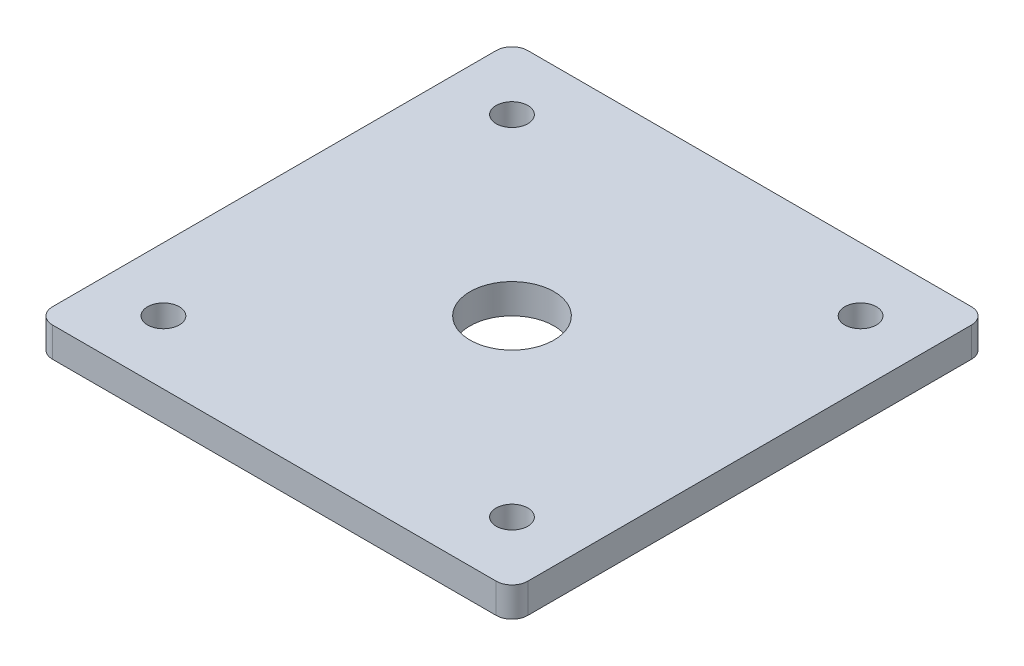
ISO-10303-21;
HEADER;
FILE_DESCRIPTION(('STEP AP214'),'2;1');
FILE_NAME('part.step','',(''),(''),'','','');
FILE_SCHEMA(('AUTOMOTIVE_DESIGN { 1 0 10303 214 1 1 1 1 }'));
ENDSEC;
DATA;
#1=APPLICATION_CONTEXT('core data for automotive mechanical design processes');
#2=APPLICATION_PROTOCOL_DEFINITION('international standard','automotive_design',2000,#1);
#3=PRODUCT_CONTEXT('',#1,'mechanical');
#4=PRODUCT('Part','Part','',(#3));
#5=PRODUCT_RELATED_PRODUCT_CATEGORY('part','',(#4));
#6=PRODUCT_DEFINITION_FORMATION('','',#4);
#7=PRODUCT_DEFINITION_CONTEXT('part definition',#1,'design');
#8=PRODUCT_DEFINITION('design','',#6,#7);
#9=PRODUCT_DEFINITION_SHAPE('','',#8);
#10=(LENGTH_UNIT() NAMED_UNIT(*) SI_UNIT(.MILLI.,.METRE.));
#11=(NAMED_UNIT(*) PLANE_ANGLE_UNIT() SI_UNIT($,.RADIAN.));
#12=(NAMED_UNIT(*) SI_UNIT($,.STERADIAN.) SOLID_ANGLE_UNIT());
#13=UNCERTAINTY_MEASURE_WITH_UNIT(LENGTH_MEASURE(1.E-05),#10,'distance_accuracy_value','');
#14=(GEOMETRIC_REPRESENTATION_CONTEXT(3) GLOBAL_UNCERTAINTY_ASSIGNED_CONTEXT((#13)) GLOBAL_UNIT_ASSIGNED_CONTEXT((#10,
#11,#12)) REPRESENTATION_CONTEXT('',''));
#15=CARTESIAN_POINT('',(0.,0.,0.));
#16=DIRECTION('',(0.,0.,1.));
#17=DIRECTION('',(1.,0.,0.));
#18=AXIS2_PLACEMENT_3D('',#15,#16,#17);
#19=CARTESIAN_POINT('',(0.,2.38125,0.));
#20=DIRECTION('',(0.,1.,0.));
#21=DIRECTION('',(0.,0.,1.));
#22=AXIS2_PLACEMENT_3D('',#19,#20,#21);
#23=PLANE('',#22);
#24=CARTESIAN_POINT('',(13.97,2.38125,-13.97));
#25=DIRECTION('',(0.,1.,0.));
#26=DIRECTION('',(0.,0.,1.));
#27=AXIS2_PLACEMENT_3D('',#24,#25,#26);
#28=CIRCLE('',#27,1.27);
#29=CARTESIAN_POINT('',(13.97,2.38125,-15.24));
#30=VERTEX_POINT('',#29);
#31=EDGE_CURVE('E195',#30,#30,#28,.T.);
#32=ORIENTED_EDGE('',*,*,#31,.F.);
#33=EDGE_LOOP('',(#32));
#34=FACE_BOUND('',#33,.T.);
#35=CARTESIAN_POINT('',(-13.97,2.38125,13.97));
#36=DIRECTION('',(0.,1.,0.));
#37=DIRECTION('',(0.,0.,1.));
#38=AXIS2_PLACEMENT_3D('',#35,#36,#37);
#39=CIRCLE('',#38,1.27);
#40=CARTESIAN_POINT('',(-13.97,2.38125,12.7));
#41=VERTEX_POINT('',#40);
#42=EDGE_CURVE('E184',#41,#41,#39,.T.);
#43=ORIENTED_EDGE('',*,*,#42,.F.);
#44=EDGE_LOOP('',(#43));
#45=FACE_BOUND('',#44,.T.);
#46=DIRECTION('',(-1.,0.,0.));
#47=VECTOR('',#46,1.);
#48=CARTESIAN_POINT('',(-19.05,2.38125,-19.05));
#49=LINE('',#48,#47);
#50=CARTESIAN_POINT('',(17.78,2.38125,-19.05));
#51=VERTEX_POINT('',#50);
#52=CARTESIAN_POINT('',(-17.78,2.38125,-19.05));
#53=VERTEX_POINT('',#52);
#54=EDGE_CURVE('E170',#51,#53,#49,.T.);
#55=ORIENTED_EDGE('',*,*,#54,.T.);
#56=CARTESIAN_POINT('',(-17.78,2.38125,-17.78));
#57=DIRECTION('',(0.,1.,0.));
#58=DIRECTION('',(0.,0.,1.));
#59=AXIS2_PLACEMENT_3D('',#56,#57,#58);
#60=CIRCLE('',#59,1.27);
#61=CARTESIAN_POINT('',(-19.05,2.38125,-17.78));
#62=VERTEX_POINT('',#61);
#63=EDGE_CURVE('E148',#53,#62,#60,.T.);
#64=ORIENTED_EDGE('',*,*,#63,.T.);
#65=DIRECTION('',(0.,0.,1.));
#66=VECTOR('',#65,1.);
#67=CARTESIAN_POINT('',(-19.05,2.38125,-19.05));
#68=LINE('',#67,#66);
#69=CARTESIAN_POINT('',(-19.05,2.38125,17.78));
#70=VERTEX_POINT('',#69);
#71=EDGE_CURVE('E118',#62,#70,#68,.T.);
#72=ORIENTED_EDGE('',*,*,#71,.T.);
#73=CARTESIAN_POINT('',(-17.78,2.38125,17.78));
#74=DIRECTION('',(0.,1.,0.));
#75=DIRECTION('',(0.,0.,1.));
#76=AXIS2_PLACEMENT_3D('',#73,#74,#75);
#77=CIRCLE('',#76,1.27);
#78=CARTESIAN_POINT('',(-17.78,2.38125,19.05));
#79=VERTEX_POINT('',#78);
#80=EDGE_CURVE('E54',#70,#79,#77,.T.);
#81=ORIENTED_EDGE('',*,*,#80,.T.);
#82=DIRECTION('',(1.,0.,0.));
#83=VECTOR('',#82,1.);
#84=CARTESIAN_POINT('',(-19.05,2.38125,19.05));
#85=LINE('',#84,#83);
#86=CARTESIAN_POINT('',(17.78,2.38125,19.05));
#87=VERTEX_POINT('',#86);
#88=EDGE_CURVE('E134',#79,#87,#85,.T.);
#89=ORIENTED_EDGE('',*,*,#88,.T.);
#90=CARTESIAN_POINT('',(17.78,2.38125,17.78));
#91=DIRECTION('',(0.,1.,0.));
#92=DIRECTION('',(0.,0.,1.));
#93=AXIS2_PLACEMENT_3D('',#90,#91,#92);
#94=CIRCLE('',#93,1.27);
#95=CARTESIAN_POINT('',(19.05,2.38125,17.78));
#96=VERTEX_POINT('',#95);
#97=EDGE_CURVE('E144',#87,#96,#94,.T.);
#98=ORIENTED_EDGE('',*,*,#97,.T.);
#99=DIRECTION('',(0.,0.,-1.));
#100=VECTOR('',#99,1.);
#101=CARTESIAN_POINT('',(19.05,2.38125,-19.05));
#102=LINE('',#101,#100);
#103=CARTESIAN_POINT('',(19.05,2.38125,-17.78));
#104=VERTEX_POINT('',#103);
#105=EDGE_CURVE('E128',#96,#104,#102,.T.);
#106=ORIENTED_EDGE('',*,*,#105,.T.);
#107=CARTESIAN_POINT('',(17.78,2.38125,-17.78));
#108=DIRECTION('',(0.,1.,0.));
#109=DIRECTION('',(0.,0.,1.));
#110=AXIS2_PLACEMENT_3D('',#107,#108,#109);
#111=CIRCLE('',#110,1.27);
#112=EDGE_CURVE('E146',#104,#51,#111,.T.);
#113=ORIENTED_EDGE('',*,*,#112,.T.);
#114=EDGE_LOOP('',(#55,#64,#72,#81,#89,#98,#106,#113));
#115=FACE_BOUND('',#114,.T.);
#116=CARTESIAN_POINT('',(-13.97,2.38125,-13.97));
#117=DIRECTION('',(0.,1.,0.));
#118=DIRECTION('',(0.,0.,1.));
#119=AXIS2_PLACEMENT_3D('',#116,#117,#118);
#120=CIRCLE('',#119,1.27);
#121=CARTESIAN_POINT('',(-13.97,2.38125,-15.24));
#122=VERTEX_POINT('',#121);
#123=EDGE_CURVE('E179',#122,#122,#120,.T.);
#124=ORIENTED_EDGE('',*,*,#123,.F.);
#125=EDGE_LOOP('',(#124));
#126=FACE_BOUND('',#125,.T.);
#127=CARTESIAN_POINT('',(13.97,2.38125,13.97));
#128=DIRECTION('',(0.,1.,0.));
#129=DIRECTION('',(0.,0.,1.));
#130=AXIS2_PLACEMENT_3D('',#127,#128,#129);
#131=CIRCLE('',#130,1.27);
#132=CARTESIAN_POINT('',(13.97,2.38125,12.7));
#133=VERTEX_POINT('',#132);
#134=EDGE_CURVE('E189',#133,#133,#131,.T.);
#135=ORIENTED_EDGE('',*,*,#134,.F.);
#136=EDGE_LOOP('',(#135));
#137=FACE_BOUND('',#136,.T.);
#138=CARTESIAN_POINT('',(0.,2.38125,0.));
#139=DIRECTION('',(0.,1.,0.));
#140=DIRECTION('',(0.,0.,1.));
#141=AXIS2_PLACEMENT_3D('',#138,#139,#140);
#142=CIRCLE('',#141,3.3655);
#143=CARTESIAN_POINT('',(0.,2.38125,-3.3655));
#144=VERTEX_POINT('',#143);
#145=EDGE_CURVE('E201',#144,#144,#142,.T.);
#146=ORIENTED_EDGE('',*,*,#145,.F.);
#147=EDGE_LOOP('',(#146));
#148=FACE_BOUND('',#147,.T.);
#149=ADVANCED_FACE('F34',(#34,#45,#115,#126,#137,#148),#23,.T.);
#150=CARTESIAN_POINT('',(0.,0.,0.));
#151=DIRECTION('',(0.,1.,0.));
#152=DIRECTION('',(0.,0.,1.));
#153=AXIS2_PLACEMENT_3D('',#150,#151,#152);
#154=PLANE('',#153);
#155=DIRECTION('',(0.,0.,1.));
#156=VECTOR('',#155,1.);
#157=CARTESIAN_POINT('',(-19.05,0.,-19.05));
#158=LINE('',#157,#156);
#159=CARTESIAN_POINT('',(-19.05,0.,-17.78));
#160=VERTEX_POINT('',#159);
#161=CARTESIAN_POINT('',(-19.05,0.,17.78));
#162=VERTEX_POINT('',#161);
#163=EDGE_CURVE('E116',#160,#162,#158,.T.);
#164=ORIENTED_EDGE('',*,*,#163,.F.);
#165=CARTESIAN_POINT('',(-17.78,0.,-17.78));
#166=DIRECTION('',(0.,1.,0.));
#167=DIRECTION('',(0.,0.,1.));
#168=AXIS2_PLACEMENT_3D('',#165,#166,#167);
#169=CIRCLE('',#168,1.27);
#170=CARTESIAN_POINT('',(-17.78,0.,-19.05));
#171=VERTEX_POINT('',#170);
#172=EDGE_CURVE('E99',#160,#171,#169,.F.);
#173=ORIENTED_EDGE('',*,*,#172,.T.);
#174=DIRECTION('',(-1.,0.,0.));
#175=VECTOR('',#174,1.);
#176=CARTESIAN_POINT('',(-19.05,0.,-19.05));
#177=LINE('',#176,#175);
#178=CARTESIAN_POINT('',(17.78,0.,-19.05));
#179=VERTEX_POINT('',#178);
#180=EDGE_CURVE('E126',#179,#171,#177,.T.);
#181=ORIENTED_EDGE('',*,*,#180,.F.);
#182=CARTESIAN_POINT('',(17.78,0.,-17.78));
#183=DIRECTION('',(0.,1.,0.));
#184=DIRECTION('',(0.,0.,1.));
#185=AXIS2_PLACEMENT_3D('',#182,#183,#184);
#186=CIRCLE('',#185,1.27);
#187=CARTESIAN_POINT('',(19.05,0.,-17.78));
#188=VERTEX_POINT('',#187);
#189=EDGE_CURVE('E110',#179,#188,#186,.F.);
#190=ORIENTED_EDGE('',*,*,#189,.T.);
#191=DIRECTION('',(0.,0.,-1.));
#192=VECTOR('',#191,1.);
#193=CARTESIAN_POINT('',(19.05,0.,-19.05));
#194=LINE('',#193,#192);
#195=CARTESIAN_POINT('',(19.05,0.,17.78));
#196=VERTEX_POINT('',#195);
#197=EDGE_CURVE('E130',#196,#188,#194,.T.);
#198=ORIENTED_EDGE('',*,*,#197,.F.);
#199=CARTESIAN_POINT('',(17.78,0.,17.78));
#200=DIRECTION('',(0.,1.,0.));
#201=DIRECTION('',(0.,0.,1.));
#202=AXIS2_PLACEMENT_3D('',#199,#200,#201);
#203=CIRCLE('',#202,1.27);
#204=CARTESIAN_POINT('',(17.78,0.,19.05));
#205=VERTEX_POINT('',#204);
#206=EDGE_CURVE('E137',#196,#205,#203,.F.);
#207=ORIENTED_EDGE('',*,*,#206,.T.);
#208=DIRECTION('',(1.,0.,0.));
#209=VECTOR('',#208,1.);
#210=CARTESIAN_POINT('',(-19.05,0.,19.05));
#211=LINE('',#210,#209);
#212=CARTESIAN_POINT('',(-17.78,0.,19.05));
#213=VERTEX_POINT('',#212);
#214=EDGE_CURVE('E125',#213,#205,#211,.T.);
#215=ORIENTED_EDGE('',*,*,#214,.F.);
#216=CARTESIAN_POINT('',(-17.78,0.,17.78));
#217=DIRECTION('',(0.,1.,0.));
#218=DIRECTION('',(0.,0.,1.));
#219=AXIS2_PLACEMENT_3D('',#216,#217,#218);
#220=CIRCLE('',#219,1.27);
#221=EDGE_CURVE('E119',#213,#162,#220,.F.);
#222=ORIENTED_EDGE('',*,*,#221,.T.);
#223=EDGE_LOOP('',(#164,#173,#181,#190,#198,#207,#215,#222));
#224=FACE_BOUND('',#223,.T.);
#225=CARTESIAN_POINT('',(-13.97,0.,-13.97));
#226=DIRECTION('',(0.,1.,0.));
#227=DIRECTION('',(0.,0.,1.));
#228=AXIS2_PLACEMENT_3D('',#225,#226,#227);
#229=CIRCLE('',#228,1.27);
#230=CARTESIAN_POINT('',(-13.97,0.,-15.24));
#231=VERTEX_POINT('',#230);
#232=EDGE_CURVE('E175',#231,#231,#229,.T.);
#233=ORIENTED_EDGE('',*,*,#232,.T.);
#234=EDGE_LOOP('',(#233));
#235=FACE_BOUND('',#234,.T.);
#236=CARTESIAN_POINT('',(-13.97,0.,13.97));
#237=DIRECTION('',(0.,1.,0.));
#238=DIRECTION('',(0.,0.,1.));
#239=AXIS2_PLACEMENT_3D('',#236,#237,#238);
#240=CIRCLE('',#239,1.27);
#241=CARTESIAN_POINT('',(-13.97,0.,12.7));
#242=VERTEX_POINT('',#241);
#243=EDGE_CURVE('E186',#242,#242,#240,.T.);
#244=ORIENTED_EDGE('',*,*,#243,.T.);
#245=EDGE_LOOP('',(#244));
#246=FACE_BOUND('',#245,.T.);
#247=CARTESIAN_POINT('',(13.97,0.,13.97));
#248=DIRECTION('',(0.,1.,0.));
#249=DIRECTION('',(0.,0.,1.));
#250=AXIS2_PLACEMENT_3D('',#247,#248,#249);
#251=CIRCLE('',#250,1.27);
#252=CARTESIAN_POINT('',(13.97,0.,12.7));
#253=VERTEX_POINT('',#252);
#254=EDGE_CURVE('E192',#253,#253,#251,.T.);
#255=ORIENTED_EDGE('',*,*,#254,.T.);
#256=EDGE_LOOP('',(#255));
#257=FACE_BOUND('',#256,.T.);
#258=CARTESIAN_POINT('',(13.97,0.,-13.97));
#259=DIRECTION('',(0.,1.,0.));
#260=DIRECTION('',(0.,0.,1.));
#261=AXIS2_PLACEMENT_3D('',#258,#259,#260);
#262=CIRCLE('',#261,1.27);
#263=CARTESIAN_POINT('',(13.97,0.,-15.24));
#264=VERTEX_POINT('',#263);
#265=EDGE_CURVE('E198',#264,#264,#262,.T.);
#266=ORIENTED_EDGE('',*,*,#265,.T.);
#267=EDGE_LOOP('',(#266));
#268=FACE_BOUND('',#267,.T.);
#269=CARTESIAN_POINT('',(0.,0.,0.));
#270=DIRECTION('',(0.,1.,0.));
#271=DIRECTION('',(0.,0.,1.));
#272=AXIS2_PLACEMENT_3D('',#269,#270,#271);
#273=CIRCLE('',#272,3.3655);
#274=CARTESIAN_POINT('',(0.,0.,-3.3655));
#275=VERTEX_POINT('',#274);
#276=EDGE_CURVE('E204',#275,#275,#273,.T.);
#277=ORIENTED_EDGE('',*,*,#276,.T.);
#278=EDGE_LOOP('',(#277));
#279=FACE_BOUND('',#278,.T.);
#280=ADVANCED_FACE('F122',(#224,#235,#246,#257,#268,#279),#154,.F.);
#281=CARTESIAN_POINT('',(19.05,2.38125,-19.05));
#282=DIRECTION('',(-1.,0.,0.));
#283=DIRECTION('',(0.,0.,1.));
#284=AXIS2_PLACEMENT_3D('',#281,#282,#283);
#285=PLANE('',#284);
#286=ORIENTED_EDGE('',*,*,#197,.T.);
#287=DIRECTION('',(0.,-1.,0.));
#288=VECTOR('',#287,1.);
#289=CARTESIAN_POINT('',(19.05,2.38125,-17.78));
#290=LINE('',#289,#288);
#291=EDGE_CURVE('E153',#188,#104,#290,.F.);
#292=ORIENTED_EDGE('',*,*,#291,.T.);
#293=ORIENTED_EDGE('',*,*,#105,.F.);
#294=DIRECTION('',(0.,-1.,0.));
#295=VECTOR('',#294,1.);
#296=CARTESIAN_POINT('',(19.05,2.38125,17.78));
#297=LINE('',#296,#295);
#298=EDGE_CURVE('E150',#96,#196,#297,.T.);
#299=ORIENTED_EDGE('',*,*,#298,.T.);
#300=EDGE_LOOP('',(#286,#292,#293,#299));
#301=FACE_BOUND('',#300,.T.);
#302=ADVANCED_FACE('F166',(#301),#285,.F.);
#303=CARTESIAN_POINT('',(-19.05,2.38125,-19.05));
#304=DIRECTION('',(0.,0.,1.));
#305=DIRECTION('',(1.,0.,0.));
#306=AXIS2_PLACEMENT_3D('',#303,#304,#305);
#307=PLANE('',#306);
#308=ORIENTED_EDGE('',*,*,#180,.T.);
#309=DIRECTION('',(0.,-1.,0.));
#310=VECTOR('',#309,1.);
#311=CARTESIAN_POINT('',(-17.78,2.38125,-19.05));
#312=LINE('',#311,#310);
#313=EDGE_CURVE('E104',#171,#53,#312,.F.);
#314=ORIENTED_EDGE('',*,*,#313,.T.);
#315=ORIENTED_EDGE('',*,*,#54,.F.);
#316=DIRECTION('',(0.,-1.,0.));
#317=VECTOR('',#316,1.);
#318=CARTESIAN_POINT('',(17.78,2.38125,-19.05));
#319=LINE('',#318,#317);
#320=EDGE_CURVE('E109',#51,#179,#319,.T.);
#321=ORIENTED_EDGE('',*,*,#320,.T.);
#322=EDGE_LOOP('',(#308,#314,#315,#321));
#323=FACE_BOUND('',#322,.T.);
#324=ADVANCED_FACE('F230',(#323),#307,.F.);
#325=CARTESIAN_POINT('',(-19.05,2.38125,-19.05));
#326=DIRECTION('',(1.,0.,0.));
#327=DIRECTION('',(0.,0.,-1.));
#328=AXIS2_PLACEMENT_3D('',#325,#326,#327);
#329=PLANE('',#328);
#330=ORIENTED_EDGE('',*,*,#71,.F.);
#331=DIRECTION('',(0.,-1.,0.));
#332=VECTOR('',#331,1.);
#333=CARTESIAN_POINT('',(-19.05,2.38125,-17.78));
#334=LINE('',#333,#332);
#335=EDGE_CURVE('E103',#62,#160,#334,.T.);
#336=ORIENTED_EDGE('',*,*,#335,.T.);
#337=ORIENTED_EDGE('',*,*,#163,.T.);
#338=DIRECTION('',(0.,-1.,0.));
#339=VECTOR('',#338,1.);
#340=CARTESIAN_POINT('',(-19.05,2.38125,17.78));
#341=LINE('',#340,#339);
#342=EDGE_CURVE('E120',#162,#70,#341,.F.);
#343=ORIENTED_EDGE('',*,*,#342,.T.);
#344=EDGE_LOOP('',(#330,#336,#337,#343));
#345=FACE_BOUND('',#344,.T.);
#346=ADVANCED_FACE('F115',(#345),#329,.F.);
#347=CARTESIAN_POINT('',(-19.05,2.38125,19.05));
#348=DIRECTION('',(0.,0.,-1.));
#349=DIRECTION('',(-1.,0.,0.));
#350=AXIS2_PLACEMENT_3D('',#347,#348,#349);
#351=PLANE('',#350);
#352=ORIENTED_EDGE('',*,*,#214,.T.);
#353=DIRECTION('',(0.,-1.,0.));
#354=VECTOR('',#353,1.);
#355=CARTESIAN_POINT('',(17.78,2.38125,19.05));
#356=LINE('',#355,#354);
#357=EDGE_CURVE('E11',#205,#87,#356,.F.);
#358=ORIENTED_EDGE('',*,*,#357,.T.);
#359=ORIENTED_EDGE('',*,*,#88,.F.);
#360=DIRECTION('',(0.,-1.,0.));
#361=VECTOR('',#360,1.);
#362=CARTESIAN_POINT('',(-17.78,2.38125,19.05));
#363=LINE('',#362,#361);
#364=EDGE_CURVE('E42',#79,#213,#363,.T.);
#365=ORIENTED_EDGE('',*,*,#364,.T.);
#366=EDGE_LOOP('',(#352,#358,#359,#365));
#367=FACE_BOUND('',#366,.T.);
#368=ADVANCED_FACE('F156',(#367),#351,.F.);
#369=CARTESIAN_POINT('',(-13.97,2.38125,-13.97));
#370=DIRECTION('',(0.,-1.,0.));
#371=DIRECTION('',(0.,0.,-1.));
#372=AXIS2_PLACEMENT_3D('',#369,#370,#371);
#373=CYLINDRICAL_SURFACE('',#372,1.27);
#374=CARTESIAN_POINT('',(-13.97,2.38125,-15.24));
#375=CARTESIAN_POINT('',(-13.97,2.3564453125,-15.24));
#376=CARTESIAN_POINT('',(-13.97,2.331640625,-15.24));
#377=CARTESIAN_POINT('',(-13.97,2.28203125,-15.24));
#378=CARTESIAN_POINT('',(-13.97,2.2572265625,-15.24));
#379=CARTESIAN_POINT('',(-13.97,2.2076171875,-15.24));
#380=CARTESIAN_POINT('',(-13.97,2.1828125,-15.24));
#381=CARTESIAN_POINT('',(-13.97,2.133203125,-15.24));
#382=CARTESIAN_POINT('',(-13.97,2.1083984375,-15.24));
#383=CARTESIAN_POINT('',(-13.97,2.0587890625,-15.24));
#384=CARTESIAN_POINT('',(-13.97,2.033984375,-15.24));
#385=CARTESIAN_POINT('',(-13.97,1.984375,-15.24));
#386=CARTESIAN_POINT('',(-13.97,1.9595703125,-15.24));
#387=CARTESIAN_POINT('',(-13.97,1.9099609375,-15.24));
#388=CARTESIAN_POINT('',(-13.97,1.88515625,-15.24));
#389=CARTESIAN_POINT('',(-13.97,1.835546875,-15.24));
#390=CARTESIAN_POINT('',(-13.97,1.8107421875,-15.24));
#391=CARTESIAN_POINT('',(-13.97,1.7611328125,-15.24));
#392=CARTESIAN_POINT('',(-13.97,1.736328125,-15.24));
#393=CARTESIAN_POINT('',(-13.97,1.68671875,-15.24));
#394=CARTESIAN_POINT('',(-13.97,1.6619140625,-15.24));
#395=CARTESIAN_POINT('',(-13.97,1.6123046875,-15.24));
#396=CARTESIAN_POINT('',(-13.97,1.5875,-15.24));
#397=CARTESIAN_POINT('',(-13.97,1.537890625,-15.24));
#398=CARTESIAN_POINT('',(-13.97,1.5130859375,-15.24));
#399=CARTESIAN_POINT('',(-13.97,1.4634765625,-15.24));
#400=CARTESIAN_POINT('',(-13.97,1.438671875,-15.24));
#401=CARTESIAN_POINT('',(-13.97,1.3890625,-15.24));
#402=CARTESIAN_POINT('',(-13.97,1.3642578125,-15.24));
#403=CARTESIAN_POINT('',(-13.97,1.3146484375,-15.24));
#404=CARTESIAN_POINT('',(-13.97,1.28984375,-15.24));
#405=CARTESIAN_POINT('',(-13.97,1.240234375,-15.24));
#406=CARTESIAN_POINT('',(-13.97,1.2154296875,-15.24));
#407=CARTESIAN_POINT('',(-13.97,1.1658203125,-15.24));
#408=CARTESIAN_POINT('',(-13.97,1.141015625,-15.24));
#409=CARTESIAN_POINT('',(-13.97,1.09140625,-15.24));
#410=CARTESIAN_POINT('',(-13.97,1.0666015625,-15.24));
#411=CARTESIAN_POINT('',(-13.97,1.0169921875,-15.24));
#412=CARTESIAN_POINT('',(-13.97,0.9921875,-15.24));
#413=CARTESIAN_POINT('',(-13.97,0.942578125,-15.24));
#414=CARTESIAN_POINT('',(-13.97,0.9177734375,-15.24));
#415=CARTESIAN_POINT('',(-13.97,0.8681640625,-15.24));
#416=CARTESIAN_POINT('',(-13.97,0.843359375,-15.24));
#417=CARTESIAN_POINT('',(-13.97,0.79375,-15.24));
#418=CARTESIAN_POINT('',(-13.97,0.7689453125,-15.24));
#419=CARTESIAN_POINT('',(-13.97,0.7193359375,-15.24));
#420=CARTESIAN_POINT('',(-13.97,0.69453125,-15.24));
#421=CARTESIAN_POINT('',(-13.97,0.644921875,-15.24));
#422=CARTESIAN_POINT('',(-13.97,0.6201171875,-15.24));
#423=CARTESIAN_POINT('',(-13.97,0.5705078125,-15.24));
#424=CARTESIAN_POINT('',(-13.97,0.545703125,-15.24));
#425=CARTESIAN_POINT('',(-13.97,0.49609375,-15.24));
#426=CARTESIAN_POINT('',(-13.97,0.4712890625,-15.24));
#427=CARTESIAN_POINT('',(-13.97,0.4216796875,-15.24));
#428=CARTESIAN_POINT('',(-13.97,0.396875,-15.24));
#429=CARTESIAN_POINT('',(-13.97,0.347265625,-15.24));
#430=CARTESIAN_POINT('',(-13.97,0.3224609375,-15.24));
#431=CARTESIAN_POINT('',(-13.97,0.2728515625,-15.24));
#432=CARTESIAN_POINT('',(-13.97,0.248046875,-15.24));
#433=CARTESIAN_POINT('',(-13.97,0.1984375,-15.24));
#434=CARTESIAN_POINT('',(-13.97,0.1736328125,-15.24));
#435=CARTESIAN_POINT('',(-13.97,0.1240234375,-15.24));
#436=CARTESIAN_POINT('',(-13.97,0.0992187500000001,-15.24));
#437=CARTESIAN_POINT('',(-13.97,0.049609375,-15.24));
#438=CARTESIAN_POINT('',(-13.97,0.0248046875,-15.24));
#439=CARTESIAN_POINT('',(-13.97,0.,-15.24));
#440=B_SPLINE_CURVE_WITH_KNOTS('',3,(#374,#375,#376,#377,#378,#379,#380,#381,#382,#383,#384,
#385,#386,#387,#388,#389,#390,#391,#392,#393,#394,#395,#396,#397,#398,#399,#400,#401,#402,#403,
#404,#405,#406,#407,#408,#409,#410,#411,#412,#413,#414,#415,#416,#417,#418,#419,#420,#421,#422,
#423,#424,#425,#426,#427,#428,#429,#430,#431,#432,#433,#434,#435,#436,#437,#438,#439),
.UNSPECIFIED.,.F.,.F.,(4,2,2,2,2,2,2,2,2,2,2,2,2,2,2,2,2,2,2,2,2,2,2,2,2,2,2,2,2,2,2,2,4),(0.,
0.0744140625,0.148828125,0.2232421875,0.29765625,0.3720703125,0.446484375,0.5208984375,
0.5953125,0.6697265625,0.744140625,0.8185546875,0.89296875,0.9673828125,1.041796875,
1.1162109375,1.190625,1.2650390625,1.339453125,1.4138671875,1.48828125,1.5626953125,1.637109375,
1.7115234375,1.7859375,1.8603515625,1.934765625,2.0091796875,2.08359375,2.1580078125,
2.232421875,2.3068359375,2.38125),.UNSPECIFIED.);
#441=EDGE_CURVE('BSEAM223',#122,#231,#440,.T.);
#442=ORIENTED_EDGE('',*,*,#123,.T.);
#443=ORIENTED_EDGE('',*,*,#232,.F.);
#444=ORIENTED_EDGE('',*,*,#441,.T.);
#445=ORIENTED_EDGE('',*,*,#441,.F.);
#446=EDGE_LOOP('',(#442,#444,#443,#445));
#447=FACE_BOUND('',#446,.T.);
#448=ADVANCED_FACE('F223',(#447),#373,.F.);
#449=CARTESIAN_POINT('',(-13.97,2.38125,13.97));
#450=DIRECTION('',(0.,-1.,0.));
#451=DIRECTION('',(0.,0.,-1.));
#452=AXIS2_PLACEMENT_3D('',#449,#450,#451);
#453=CYLINDRICAL_SURFACE('',#452,1.27);
#454=CARTESIAN_POINT('',(-13.97,2.38125,12.7));
#455=CARTESIAN_POINT('',(-13.97,2.3564453125,12.7));
#456=CARTESIAN_POINT('',(-13.97,2.331640625,12.7));
#457=CARTESIAN_POINT('',(-13.97,2.28203125,12.7));
#458=CARTESIAN_POINT('',(-13.97,2.2572265625,12.7));
#459=CARTESIAN_POINT('',(-13.97,2.2076171875,12.7));
#460=CARTESIAN_POINT('',(-13.97,2.1828125,12.7));
#461=CARTESIAN_POINT('',(-13.97,2.133203125,12.7));
#462=CARTESIAN_POINT('',(-13.97,2.1083984375,12.7));
#463=CARTESIAN_POINT('',(-13.97,2.0587890625,12.7));
#464=CARTESIAN_POINT('',(-13.97,2.033984375,12.7));
#465=CARTESIAN_POINT('',(-13.97,1.984375,12.7));
#466=CARTESIAN_POINT('',(-13.97,1.9595703125,12.7));
#467=CARTESIAN_POINT('',(-13.97,1.9099609375,12.7));
#468=CARTESIAN_POINT('',(-13.97,1.88515625,12.7));
#469=CARTESIAN_POINT('',(-13.97,1.835546875,12.7));
#470=CARTESIAN_POINT('',(-13.97,1.8107421875,12.7));
#471=CARTESIAN_POINT('',(-13.97,1.7611328125,12.7));
#472=CARTESIAN_POINT('',(-13.97,1.736328125,12.7));
#473=CARTESIAN_POINT('',(-13.97,1.68671875,12.7));
#474=CARTESIAN_POINT('',(-13.97,1.6619140625,12.7));
#475=CARTESIAN_POINT('',(-13.97,1.6123046875,12.7));
#476=CARTESIAN_POINT('',(-13.97,1.5875,12.7));
#477=CARTESIAN_POINT('',(-13.97,1.537890625,12.7));
#478=CARTESIAN_POINT('',(-13.97,1.5130859375,12.7));
#479=CARTESIAN_POINT('',(-13.97,1.4634765625,12.7));
#480=CARTESIAN_POINT('',(-13.97,1.438671875,12.7));
#481=CARTESIAN_POINT('',(-13.97,1.3890625,12.7));
#482=CARTESIAN_POINT('',(-13.97,1.3642578125,12.7));
#483=CARTESIAN_POINT('',(-13.97,1.3146484375,12.7));
#484=CARTESIAN_POINT('',(-13.97,1.28984375,12.7));
#485=CARTESIAN_POINT('',(-13.97,1.240234375,12.7));
#486=CARTESIAN_POINT('',(-13.97,1.2154296875,12.7));
#487=CARTESIAN_POINT('',(-13.97,1.1658203125,12.7));
#488=CARTESIAN_POINT('',(-13.97,1.141015625,12.7));
#489=CARTESIAN_POINT('',(-13.97,1.09140625,12.7));
#490=CARTESIAN_POINT('',(-13.97,1.0666015625,12.7));
#491=CARTESIAN_POINT('',(-13.97,1.0169921875,12.7));
#492=CARTESIAN_POINT('',(-13.97,0.9921875,12.7));
#493=CARTESIAN_POINT('',(-13.97,0.942578125,12.7));
#494=CARTESIAN_POINT('',(-13.97,0.9177734375,12.7));
#495=CARTESIAN_POINT('',(-13.97,0.8681640625,12.7));
#496=CARTESIAN_POINT('',(-13.97,0.843359375,12.7));
#497=CARTESIAN_POINT('',(-13.97,0.79375,12.7));
#498=CARTESIAN_POINT('',(-13.97,0.7689453125,12.7));
#499=CARTESIAN_POINT('',(-13.97,0.7193359375,12.7));
#500=CARTESIAN_POINT('',(-13.97,0.69453125,12.7));
#501=CARTESIAN_POINT('',(-13.97,0.644921875,12.7));
#502=CARTESIAN_POINT('',(-13.97,0.6201171875,12.7));
#503=CARTESIAN_POINT('',(-13.97,0.5705078125,12.7));
#504=CARTESIAN_POINT('',(-13.97,0.545703125,12.7));
#505=CARTESIAN_POINT('',(-13.97,0.49609375,12.7));
#506=CARTESIAN_POINT('',(-13.97,0.4712890625,12.7));
#507=CARTESIAN_POINT('',(-13.97,0.4216796875,12.7));
#508=CARTESIAN_POINT('',(-13.97,0.396875,12.7));
#509=CARTESIAN_POINT('',(-13.97,0.347265625,12.7));
#510=CARTESIAN_POINT('',(-13.97,0.3224609375,12.7));
#511=CARTESIAN_POINT('',(-13.97,0.2728515625,12.7));
#512=CARTESIAN_POINT('',(-13.97,0.248046875,12.7));
#513=CARTESIAN_POINT('',(-13.97,0.1984375,12.7));
#514=CARTESIAN_POINT('',(-13.97,0.1736328125,12.7));
#515=CARTESIAN_POINT('',(-13.97,0.1240234375,12.7));
#516=CARTESIAN_POINT('',(-13.97,0.0992187500000001,12.7));
#517=CARTESIAN_POINT('',(-13.97,0.049609375,12.7));
#518=CARTESIAN_POINT('',(-13.97,0.0248046875,12.7));
#519=CARTESIAN_POINT('',(-13.97,0.,12.7));
#520=B_SPLINE_CURVE_WITH_KNOTS('',3,(#454,#455,#456,#457,#458,#459,#460,#461,#462,#463,#464,
#465,#466,#467,#468,#469,#470,#471,#472,#473,#474,#475,#476,#477,#478,#479,#480,#481,#482,#483,
#484,#485,#486,#487,#488,#489,#490,#491,#492,#493,#494,#495,#496,#497,#498,#499,#500,#501,#502,
#503,#504,#505,#506,#507,#508,#509,#510,#511,#512,#513,#514,#515,#516,#517,#518,#519),
.UNSPECIFIED.,.F.,.F.,(4,2,2,2,2,2,2,2,2,2,2,2,2,2,2,2,2,2,2,2,2,2,2,2,2,2,2,2,2,2,2,2,4),(0.,
0.0744140625,0.148828125,0.2232421875,0.29765625,0.3720703125,0.446484375,0.5208984375,
0.5953125,0.6697265625,0.744140625,0.8185546875,0.89296875,0.9673828125,1.041796875,
1.1162109375,1.190625,1.2650390625,1.339453125,1.4138671875,1.48828125,1.5626953125,1.637109375,
1.7115234375,1.7859375,1.8603515625,1.934765625,2.0091796875,2.08359375,2.1580078125,
2.232421875,2.3068359375,2.38125),.UNSPECIFIED.);
#521=EDGE_CURVE('BSEAM257',#41,#242,#520,.T.);
#522=ORIENTED_EDGE('',*,*,#42,.T.);
#523=ORIENTED_EDGE('',*,*,#243,.F.);
#524=ORIENTED_EDGE('',*,*,#521,.T.);
#525=ORIENTED_EDGE('',*,*,#521,.F.);
#526=EDGE_LOOP('',(#522,#524,#523,#525));
#527=FACE_BOUND('',#526,.T.);
#528=ADVANCED_FACE('F257',(#527),#453,.F.);
#529=CARTESIAN_POINT('',(13.97,2.38125,13.97));
#530=DIRECTION('',(0.,-1.,0.));
#531=DIRECTION('',(0.,0.,-1.));
#532=AXIS2_PLACEMENT_3D('',#529,#530,#531);
#533=CYLINDRICAL_SURFACE('',#532,1.27);
#534=CARTESIAN_POINT('',(13.97,2.38125,12.7));
#535=CARTESIAN_POINT('',(13.97,2.3564453125,12.7));
#536=CARTESIAN_POINT('',(13.97,2.331640625,12.7));
#537=CARTESIAN_POINT('',(13.97,2.28203125,12.7));
#538=CARTESIAN_POINT('',(13.97,2.2572265625,12.7));
#539=CARTESIAN_POINT('',(13.97,2.2076171875,12.7));
#540=CARTESIAN_POINT('',(13.97,2.1828125,12.7));
#541=CARTESIAN_POINT('',(13.97,2.133203125,12.7));
#542=CARTESIAN_POINT('',(13.97,2.1083984375,12.7));
#543=CARTESIAN_POINT('',(13.97,2.0587890625,12.7));
#544=CARTESIAN_POINT('',(13.97,2.033984375,12.7));
#545=CARTESIAN_POINT('',(13.97,1.984375,12.7));
#546=CARTESIAN_POINT('',(13.97,1.9595703125,12.7));
#547=CARTESIAN_POINT('',(13.97,1.9099609375,12.7));
#548=CARTESIAN_POINT('',(13.97,1.88515625,12.7));
#549=CARTESIAN_POINT('',(13.97,1.835546875,12.7));
#550=CARTESIAN_POINT('',(13.97,1.8107421875,12.7));
#551=CARTESIAN_POINT('',(13.97,1.7611328125,12.7));
#552=CARTESIAN_POINT('',(13.97,1.736328125,12.7));
#553=CARTESIAN_POINT('',(13.97,1.68671875,12.7));
#554=CARTESIAN_POINT('',(13.97,1.6619140625,12.7));
#555=CARTESIAN_POINT('',(13.97,1.6123046875,12.7));
#556=CARTESIAN_POINT('',(13.97,1.5875,12.7));
#557=CARTESIAN_POINT('',(13.97,1.537890625,12.7));
#558=CARTESIAN_POINT('',(13.97,1.5130859375,12.7));
#559=CARTESIAN_POINT('',(13.97,1.4634765625,12.7));
#560=CARTESIAN_POINT('',(13.97,1.438671875,12.7));
#561=CARTESIAN_POINT('',(13.97,1.3890625,12.7));
#562=CARTESIAN_POINT('',(13.97,1.3642578125,12.7));
#563=CARTESIAN_POINT('',(13.97,1.3146484375,12.7));
#564=CARTESIAN_POINT('',(13.97,1.28984375,12.7));
#565=CARTESIAN_POINT('',(13.97,1.240234375,12.7));
#566=CARTESIAN_POINT('',(13.97,1.2154296875,12.7));
#567=CARTESIAN_POINT('',(13.97,1.1658203125,12.7));
#568=CARTESIAN_POINT('',(13.97,1.141015625,12.7));
#569=CARTESIAN_POINT('',(13.97,1.09140625,12.7));
#570=CARTESIAN_POINT('',(13.97,1.0666015625,12.7));
#571=CARTESIAN_POINT('',(13.97,1.0169921875,12.7));
#572=CARTESIAN_POINT('',(13.97,0.9921875,12.7));
#573=CARTESIAN_POINT('',(13.97,0.942578125,12.7));
#574=CARTESIAN_POINT('',(13.97,0.9177734375,12.7));
#575=CARTESIAN_POINT('',(13.97,0.8681640625,12.7));
#576=CARTESIAN_POINT('',(13.97,0.843359375,12.7));
#577=CARTESIAN_POINT('',(13.97,0.79375,12.7));
#578=CARTESIAN_POINT('',(13.97,0.7689453125,12.7));
#579=CARTESIAN_POINT('',(13.97,0.7193359375,12.7));
#580=CARTESIAN_POINT('',(13.97,0.69453125,12.7));
#581=CARTESIAN_POINT('',(13.97,0.644921875,12.7));
#582=CARTESIAN_POINT('',(13.97,0.6201171875,12.7));
#583=CARTESIAN_POINT('',(13.97,0.5705078125,12.7));
#584=CARTESIAN_POINT('',(13.97,0.545703125,12.7));
#585=CARTESIAN_POINT('',(13.97,0.49609375,12.7));
#586=CARTESIAN_POINT('',(13.97,0.4712890625,12.7));
#587=CARTESIAN_POINT('',(13.97,0.4216796875,12.7));
#588=CARTESIAN_POINT('',(13.97,0.396875,12.7));
#589=CARTESIAN_POINT('',(13.97,0.347265625,12.7));
#590=CARTESIAN_POINT('',(13.97,0.3224609375,12.7));
#591=CARTESIAN_POINT('',(13.97,0.2728515625,12.7));
#592=CARTESIAN_POINT('',(13.97,0.248046875,12.7));
#593=CARTESIAN_POINT('',(13.97,0.1984375,12.7));
#594=CARTESIAN_POINT('',(13.97,0.1736328125,12.7));
#595=CARTESIAN_POINT('',(13.97,0.1240234375,12.7));
#596=CARTESIAN_POINT('',(13.97,0.0992187500000001,12.7));
#597=CARTESIAN_POINT('',(13.97,0.049609375,12.7));
#598=CARTESIAN_POINT('',(13.97,0.0248046875,12.7));
#599=CARTESIAN_POINT('',(13.97,0.,12.7));
#600=B_SPLINE_CURVE_WITH_KNOTS('',3,(#534,#535,#536,#537,#538,#539,#540,#541,#542,#543,#544,
#545,#546,#547,#548,#549,#550,#551,#552,#553,#554,#555,#556,#557,#558,#559,#560,#561,#562,#563,
#564,#565,#566,#567,#568,#569,#570,#571,#572,#573,#574,#575,#576,#577,#578,#579,#580,#581,#582,
#583,#584,#585,#586,#587,#588,#589,#590,#591,#592,#593,#594,#595,#596,#597,#598,#599),
.UNSPECIFIED.,.F.,.F.,(4,2,2,2,2,2,2,2,2,2,2,2,2,2,2,2,2,2,2,2,2,2,2,2,2,2,2,2,2,2,2,2,4),(0.,
0.0744140625,0.148828125,0.2232421875,0.29765625,0.3720703125,0.446484375,0.5208984375,
0.5953125,0.6697265625,0.744140625,0.8185546875,0.89296875,0.9673828125,1.041796875,
1.1162109375,1.190625,1.2650390625,1.339453125,1.4138671875,1.48828125,1.5626953125,1.637109375,
1.7115234375,1.7859375,1.8603515625,1.934765625,2.0091796875,2.08359375,2.1580078125,
2.232421875,2.3068359375,2.38125),.UNSPECIFIED.);
#601=EDGE_CURVE('BSEAM253',#133,#253,#600,.T.);
#602=ORIENTED_EDGE('',*,*,#134,.T.);
#603=ORIENTED_EDGE('',*,*,#254,.F.);
#604=ORIENTED_EDGE('',*,*,#601,.T.);
#605=ORIENTED_EDGE('',*,*,#601,.F.);
#606=EDGE_LOOP('',(#602,#604,#603,#605));
#607=FACE_BOUND('',#606,.T.);
#608=ADVANCED_FACE('F253',(#607),#533,.F.);
#609=CARTESIAN_POINT('',(13.97,2.38125,-13.97));
#610=DIRECTION('',(0.,-1.,0.));
#611=DIRECTION('',(0.,0.,-1.));
#612=AXIS2_PLACEMENT_3D('',#609,#610,#611);
#613=CYLINDRICAL_SURFACE('',#612,1.27);
#614=CARTESIAN_POINT('',(13.97,2.38125,-15.24));
#615=CARTESIAN_POINT('',(13.97,2.3564453125,-15.24));
#616=CARTESIAN_POINT('',(13.97,2.331640625,-15.24));
#617=CARTESIAN_POINT('',(13.97,2.28203125,-15.24));
#618=CARTESIAN_POINT('',(13.97,2.2572265625,-15.24));
#619=CARTESIAN_POINT('',(13.97,2.2076171875,-15.24));
#620=CARTESIAN_POINT('',(13.97,2.1828125,-15.24));
#621=CARTESIAN_POINT('',(13.97,2.133203125,-15.24));
#622=CARTESIAN_POINT('',(13.97,2.1083984375,-15.24));
#623=CARTESIAN_POINT('',(13.97,2.0587890625,-15.24));
#624=CARTESIAN_POINT('',(13.97,2.033984375,-15.24));
#625=CARTESIAN_POINT('',(13.97,1.984375,-15.24));
#626=CARTESIAN_POINT('',(13.97,1.9595703125,-15.24));
#627=CARTESIAN_POINT('',(13.97,1.9099609375,-15.24));
#628=CARTESIAN_POINT('',(13.97,1.88515625,-15.24));
#629=CARTESIAN_POINT('',(13.97,1.835546875,-15.24));
#630=CARTESIAN_POINT('',(13.97,1.8107421875,-15.24));
#631=CARTESIAN_POINT('',(13.97,1.7611328125,-15.24));
#632=CARTESIAN_POINT('',(13.97,1.736328125,-15.24));
#633=CARTESIAN_POINT('',(13.97,1.68671875,-15.24));
#634=CARTESIAN_POINT('',(13.97,1.6619140625,-15.24));
#635=CARTESIAN_POINT('',(13.97,1.6123046875,-15.24));
#636=CARTESIAN_POINT('',(13.97,1.5875,-15.24));
#637=CARTESIAN_POINT('',(13.97,1.537890625,-15.24));
#638=CARTESIAN_POINT('',(13.97,1.5130859375,-15.24));
#639=CARTESIAN_POINT('',(13.97,1.4634765625,-15.24));
#640=CARTESIAN_POINT('',(13.97,1.438671875,-15.24));
#641=CARTESIAN_POINT('',(13.97,1.3890625,-15.24));
#642=CARTESIAN_POINT('',(13.97,1.3642578125,-15.24));
#643=CARTESIAN_POINT('',(13.97,1.3146484375,-15.24));
#644=CARTESIAN_POINT('',(13.97,1.28984375,-15.24));
#645=CARTESIAN_POINT('',(13.97,1.240234375,-15.24));
#646=CARTESIAN_POINT('',(13.97,1.2154296875,-15.24));
#647=CARTESIAN_POINT('',(13.97,1.1658203125,-15.24));
#648=CARTESIAN_POINT('',(13.97,1.141015625,-15.24));
#649=CARTESIAN_POINT('',(13.97,1.09140625,-15.24));
#650=CARTESIAN_POINT('',(13.97,1.0666015625,-15.24));
#651=CARTESIAN_POINT('',(13.97,1.0169921875,-15.24));
#652=CARTESIAN_POINT('',(13.97,0.9921875,-15.24));
#653=CARTESIAN_POINT('',(13.97,0.942578125,-15.24));
#654=CARTESIAN_POINT('',(13.97,0.9177734375,-15.24));
#655=CARTESIAN_POINT('',(13.97,0.8681640625,-15.24));
#656=CARTESIAN_POINT('',(13.97,0.843359375,-15.24));
#657=CARTESIAN_POINT('',(13.97,0.79375,-15.24));
#658=CARTESIAN_POINT('',(13.97,0.7689453125,-15.24));
#659=CARTESIAN_POINT('',(13.97,0.7193359375,-15.24));
#660=CARTESIAN_POINT('',(13.97,0.69453125,-15.24));
#661=CARTESIAN_POINT('',(13.97,0.644921875,-15.24));
#662=CARTESIAN_POINT('',(13.97,0.6201171875,-15.24));
#663=CARTESIAN_POINT('',(13.97,0.5705078125,-15.24));
#664=CARTESIAN_POINT('',(13.97,0.545703125,-15.24));
#665=CARTESIAN_POINT('',(13.97,0.49609375,-15.24));
#666=CARTESIAN_POINT('',(13.97,0.4712890625,-15.24));
#667=CARTESIAN_POINT('',(13.97,0.4216796875,-15.24));
#668=CARTESIAN_POINT('',(13.97,0.396875,-15.24));
#669=CARTESIAN_POINT('',(13.97,0.347265625,-15.24));
#670=CARTESIAN_POINT('',(13.97,0.3224609375,-15.24));
#671=CARTESIAN_POINT('',(13.97,0.2728515625,-15.24));
#672=CARTESIAN_POINT('',(13.97,0.248046875,-15.24));
#673=CARTESIAN_POINT('',(13.97,0.1984375,-15.24));
#674=CARTESIAN_POINT('',(13.97,0.1736328125,-15.24));
#675=CARTESIAN_POINT('',(13.97,0.1240234375,-15.24));
#676=CARTESIAN_POINT('',(13.97,0.0992187500000001,-15.24));
#677=CARTESIAN_POINT('',(13.97,0.049609375,-15.24));
#678=CARTESIAN_POINT('',(13.97,0.0248046875,-15.24));
#679=CARTESIAN_POINT('',(13.97,0.,-15.24));
#680=B_SPLINE_CURVE_WITH_KNOTS('',3,(#614,#615,#616,#617,#618,#619,#620,#621,#622,#623,#624,
#625,#626,#627,#628,#629,#630,#631,#632,#633,#634,#635,#636,#637,#638,#639,#640,#641,#642,#643,
#644,#645,#646,#647,#648,#649,#650,#651,#652,#653,#654,#655,#656,#657,#658,#659,#660,#661,#662,
#663,#664,#665,#666,#667,#668,#669,#670,#671,#672,#673,#674,#675,#676,#677,#678,#679),
.UNSPECIFIED.,.F.,.F.,(4,2,2,2,2,2,2,2,2,2,2,2,2,2,2,2,2,2,2,2,2,2,2,2,2,2,2,2,2,2,2,2,4),(0.,
0.0744140625,0.148828125,0.2232421875,0.29765625,0.3720703125,0.446484375,0.5208984375,
0.5953125,0.6697265625,0.744140625,0.8185546875,0.89296875,0.9673828125,1.041796875,
1.1162109375,1.190625,1.2650390625,1.339453125,1.4138671875,1.48828125,1.5626953125,1.637109375,
1.7115234375,1.7859375,1.8603515625,1.934765625,2.0091796875,2.08359375,2.1580078125,
2.232421875,2.3068359375,2.38125),.UNSPECIFIED.);
#681=EDGE_CURVE('BSEAM256',#30,#264,#680,.T.);
#682=ORIENTED_EDGE('',*,*,#31,.T.);
#683=ORIENTED_EDGE('',*,*,#265,.F.);
#684=ORIENTED_EDGE('',*,*,#681,.T.);
#685=ORIENTED_EDGE('',*,*,#681,.F.);
#686=EDGE_LOOP('',(#682,#684,#683,#685));
#687=FACE_BOUND('',#686,.T.);
#688=ADVANCED_FACE('F256',(#687),#613,.F.);
#689=CARTESIAN_POINT('',(0.,2.38125,0.));
#690=DIRECTION('',(0.,-1.,0.));
#691=DIRECTION('',(0.,0.,-1.));
#692=AXIS2_PLACEMENT_3D('',#689,#690,#691);
#693=CYLINDRICAL_SURFACE('',#692,3.3655);
#694=CARTESIAN_POINT('',(0.,2.38125,-3.3655));
#695=CARTESIAN_POINT('',(0.,2.3564453125,-3.3655));
#696=CARTESIAN_POINT('',(0.,2.331640625,-3.3655));
#697=CARTESIAN_POINT('',(0.,2.28203125,-3.3655));
#698=CARTESIAN_POINT('',(0.,2.2572265625,-3.3655));
#699=CARTESIAN_POINT('',(0.,2.2076171875,-3.3655));
#700=CARTESIAN_POINT('',(0.,2.1828125,-3.3655));
#701=CARTESIAN_POINT('',(0.,2.133203125,-3.3655));
#702=CARTESIAN_POINT('',(0.,2.1083984375,-3.3655));
#703=CARTESIAN_POINT('',(0.,2.0587890625,-3.3655));
#704=CARTESIAN_POINT('',(0.,2.033984375,-3.3655));
#705=CARTESIAN_POINT('',(0.,1.984375,-3.3655));
#706=CARTESIAN_POINT('',(0.,1.9595703125,-3.3655));
#707=CARTESIAN_POINT('',(0.,1.9099609375,-3.3655));
#708=CARTESIAN_POINT('',(0.,1.88515625,-3.3655));
#709=CARTESIAN_POINT('',(0.,1.835546875,-3.3655));
#710=CARTESIAN_POINT('',(0.,1.8107421875,-3.3655));
#711=CARTESIAN_POINT('',(0.,1.7611328125,-3.3655));
#712=CARTESIAN_POINT('',(0.,1.736328125,-3.3655));
#713=CARTESIAN_POINT('',(0.,1.68671875,-3.3655));
#714=CARTESIAN_POINT('',(0.,1.6619140625,-3.3655));
#715=CARTESIAN_POINT('',(0.,1.6123046875,-3.3655));
#716=CARTESIAN_POINT('',(0.,1.5875,-3.3655));
#717=CARTESIAN_POINT('',(0.,1.537890625,-3.3655));
#718=CARTESIAN_POINT('',(0.,1.5130859375,-3.3655));
#719=CARTESIAN_POINT('',(0.,1.4634765625,-3.3655));
#720=CARTESIAN_POINT('',(0.,1.438671875,-3.3655));
#721=CARTESIAN_POINT('',(0.,1.3890625,-3.3655));
#722=CARTESIAN_POINT('',(0.,1.3642578125,-3.3655));
#723=CARTESIAN_POINT('',(0.,1.3146484375,-3.3655));
#724=CARTESIAN_POINT('',(0.,1.28984375,-3.3655));
#725=CARTESIAN_POINT('',(0.,1.240234375,-3.3655));
#726=CARTESIAN_POINT('',(0.,1.2154296875,-3.3655));
#727=CARTESIAN_POINT('',(0.,1.1658203125,-3.3655));
#728=CARTESIAN_POINT('',(0.,1.141015625,-3.3655));
#729=CARTESIAN_POINT('',(0.,1.09140625,-3.3655));
#730=CARTESIAN_POINT('',(0.,1.0666015625,-3.3655));
#731=CARTESIAN_POINT('',(0.,1.0169921875,-3.3655));
#732=CARTESIAN_POINT('',(0.,0.9921875,-3.3655));
#733=CARTESIAN_POINT('',(0.,0.942578125,-3.3655));
#734=CARTESIAN_POINT('',(0.,0.9177734375,-3.3655));
#735=CARTESIAN_POINT('',(0.,0.8681640625,-3.3655));
#736=CARTESIAN_POINT('',(0.,0.843359375,-3.3655));
#737=CARTESIAN_POINT('',(0.,0.79375,-3.3655));
#738=CARTESIAN_POINT('',(0.,0.7689453125,-3.3655));
#739=CARTESIAN_POINT('',(0.,0.7193359375,-3.3655));
#740=CARTESIAN_POINT('',(0.,0.69453125,-3.3655));
#741=CARTESIAN_POINT('',(0.,0.644921875,-3.3655));
#742=CARTESIAN_POINT('',(0.,0.6201171875,-3.3655));
#743=CARTESIAN_POINT('',(0.,0.5705078125,-3.3655));
#744=CARTESIAN_POINT('',(0.,0.545703125,-3.3655));
#745=CARTESIAN_POINT('',(0.,0.49609375,-3.3655));
#746=CARTESIAN_POINT('',(0.,0.4712890625,-3.3655));
#747=CARTESIAN_POINT('',(0.,0.4216796875,-3.3655));
#748=CARTESIAN_POINT('',(0.,0.396875,-3.3655));
#749=CARTESIAN_POINT('',(0.,0.347265625,-3.3655));
#750=CARTESIAN_POINT('',(0.,0.3224609375,-3.3655));
#751=CARTESIAN_POINT('',(0.,0.2728515625,-3.3655));
#752=CARTESIAN_POINT('',(0.,0.248046875,-3.3655));
#753=CARTESIAN_POINT('',(0.,0.1984375,-3.3655));
#754=CARTESIAN_POINT('',(0.,0.1736328125,-3.3655));
#755=CARTESIAN_POINT('',(0.,0.1240234375,-3.3655));
#756=CARTESIAN_POINT('',(0.,0.0992187500000001,-3.3655));
#757=CARTESIAN_POINT('',(0.,0.049609375,-3.3655));
#758=CARTESIAN_POINT('',(0.,0.0248046875,-3.3655));
#759=CARTESIAN_POINT('',(0.,0.,-3.3655));
#760=B_SPLINE_CURVE_WITH_KNOTS('',3,(#694,#695,#696,#697,#698,#699,#700,#701,#702,#703,#704,
#705,#706,#707,#708,#709,#710,#711,#712,#713,#714,#715,#716,#717,#718,#719,#720,#721,#722,#723,
#724,#725,#726,#727,#728,#729,#730,#731,#732,#733,#734,#735,#736,#737,#738,#739,#740,#741,#742,
#743,#744,#745,#746,#747,#748,#749,#750,#751,#752,#753,#754,#755,#756,#757,#758,#759),
.UNSPECIFIED.,.F.,.F.,(4,2,2,2,2,2,2,2,2,2,2,2,2,2,2,2,2,2,2,2,2,2,2,2,2,2,2,2,2,2,2,2,4),(0.,
0.0744140625,0.148828125,0.2232421875,0.29765625,0.3720703125,0.446484375,0.5208984375,
0.5953125,0.6697265625,0.744140625,0.8185546875,0.89296875,0.9673828125,1.041796875,
1.1162109375,1.190625,1.2650390625,1.339453125,1.4138671875,1.48828125,1.5626953125,1.637109375,
1.7115234375,1.7859375,1.8603515625,1.934765625,2.0091796875,2.08359375,2.1580078125,
2.232421875,2.3068359375,2.38125),.UNSPECIFIED.);
#761=EDGE_CURVE('BSEAM210',#144,#275,#760,.T.);
#762=ORIENTED_EDGE('',*,*,#145,.T.);
#763=ORIENTED_EDGE('',*,*,#276,.F.);
#764=ORIENTED_EDGE('',*,*,#761,.T.);
#765=ORIENTED_EDGE('',*,*,#761,.F.);
#766=EDGE_LOOP('',(#762,#764,#763,#765));
#767=FACE_BOUND('',#766,.T.);
#768=ADVANCED_FACE('F210',(#767),#693,.F.);
#769=CARTESIAN_POINT('',(-17.78,2.38125,-17.78));
#770=DIRECTION('',(0.,-1.,0.));
#771=DIRECTION('',(0.,0.,-1.));
#772=AXIS2_PLACEMENT_3D('',#769,#770,#771);
#773=CYLINDRICAL_SURFACE('',#772,1.27);
#774=ORIENTED_EDGE('',*,*,#63,.F.);
#775=ORIENTED_EDGE('',*,*,#313,.F.);
#776=ORIENTED_EDGE('',*,*,#172,.F.);
#777=ORIENTED_EDGE('',*,*,#335,.F.);
#778=EDGE_LOOP('',(#774,#775,#776,#777));
#779=FACE_BOUND('',#778,.T.);
#780=ADVANCED_FACE('F102',(#779),#773,.T.);
#781=CARTESIAN_POINT('',(17.78,2.38125,-17.78));
#782=DIRECTION('',(0.,-1.,0.));
#783=DIRECTION('',(0.,0.,-1.));
#784=AXIS2_PLACEMENT_3D('',#781,#782,#783);
#785=CYLINDRICAL_SURFACE('',#784,1.27);
#786=ORIENTED_EDGE('',*,*,#112,.F.);
#787=ORIENTED_EDGE('',*,*,#291,.F.);
#788=ORIENTED_EDGE('',*,*,#189,.F.);
#789=ORIENTED_EDGE('',*,*,#320,.F.);
#790=EDGE_LOOP('',(#786,#787,#788,#789));
#791=FACE_BOUND('',#790,.T.);
#792=ADVANCED_FACE('F238',(#791),#785,.T.);
#793=CARTESIAN_POINT('',(17.78,2.38125,17.78));
#794=DIRECTION('',(0.,-1.,0.));
#795=DIRECTION('',(0.,0.,-1.));
#796=AXIS2_PLACEMENT_3D('',#793,#794,#795);
#797=CYLINDRICAL_SURFACE('',#796,1.27);
#798=ORIENTED_EDGE('',*,*,#97,.F.);
#799=ORIENTED_EDGE('',*,*,#357,.F.);
#800=ORIENTED_EDGE('',*,*,#206,.F.);
#801=ORIENTED_EDGE('',*,*,#298,.F.);
#802=EDGE_LOOP('',(#798,#799,#800,#801));
#803=FACE_BOUND('',#802,.T.);
#804=ADVANCED_FACE('F163',(#803),#797,.T.);
#805=CARTESIAN_POINT('',(-17.78,2.38125,17.78));
#806=DIRECTION('',(0.,-1.,0.));
#807=DIRECTION('',(0.,0.,-1.));
#808=AXIS2_PLACEMENT_3D('',#805,#806,#807);
#809=CYLINDRICAL_SURFACE('',#808,1.27);
#810=ORIENTED_EDGE('',*,*,#80,.F.);
#811=ORIENTED_EDGE('',*,*,#342,.F.);
#812=ORIENTED_EDGE('',*,*,#221,.F.);
#813=ORIENTED_EDGE('',*,*,#364,.F.);
#814=EDGE_LOOP('',(#810,#811,#812,#813));
#815=FACE_BOUND('',#814,.T.);
#816=ADVANCED_FACE('F36',(#815),#809,.T.);
#817=CLOSED_SHELL('',(#149,#280,#302,#324,#346,#368,#448,#528,#608,#688,#768,#780,#792,#804,#816));
#818=MANIFOLD_SOLID_BREP('B2',#817);
#819=ADVANCED_BREP_SHAPE_REPRESENTATION('',(#18,#818),#14);
#820=SHAPE_DEFINITION_REPRESENTATION(#9,#819);
ENDSEC;
END-ISO-10303-21;
